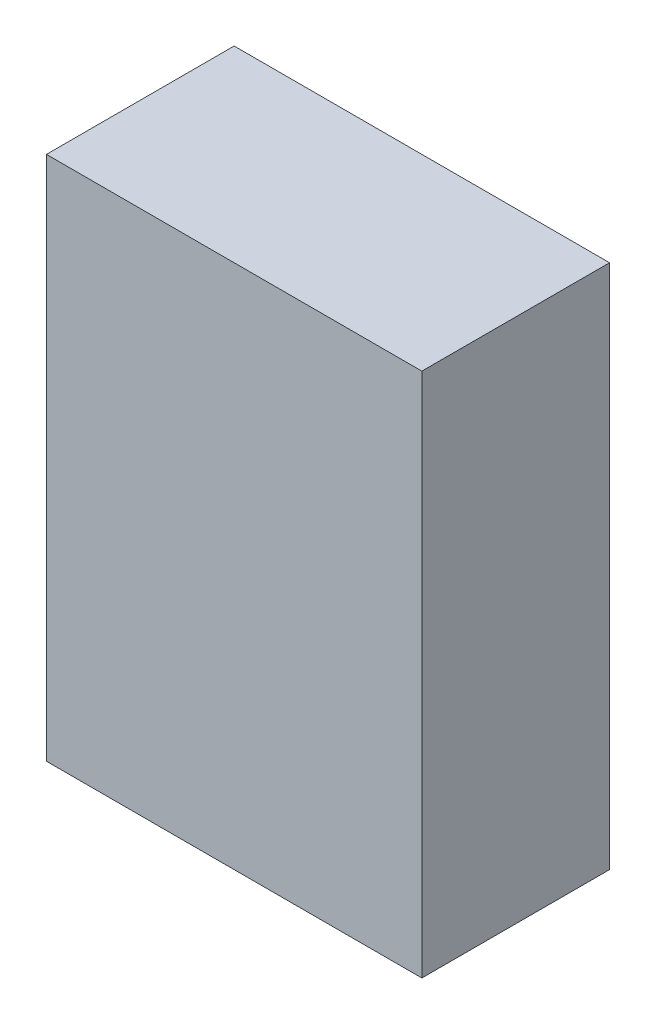
ISO-10303-21;
HEADER;
FILE_DESCRIPTION(('STEP AP214'),'2;1');
FILE_NAME('part.step','',(''),(''),'','','');
FILE_SCHEMA(('AUTOMOTIVE_DESIGN { 1 0 10303 214 1 1 1 1 }'));
ENDSEC;
DATA;
#1=APPLICATION_CONTEXT('core data for automotive mechanical design processes');
#2=APPLICATION_PROTOCOL_DEFINITION('international standard','automotive_design',2000,#1);
#3=PRODUCT_CONTEXT('',#1,'mechanical');
#4=PRODUCT('Part','Part','',(#3));
#5=PRODUCT_RELATED_PRODUCT_CATEGORY('part','',(#4));
#6=PRODUCT_DEFINITION_FORMATION('','',#4);
#7=PRODUCT_DEFINITION_CONTEXT('part definition',#1,'design');
#8=PRODUCT_DEFINITION('design','',#6,#7);
#9=PRODUCT_DEFINITION_SHAPE('','',#8);
#10=(LENGTH_UNIT() NAMED_UNIT(*) SI_UNIT(.MILLI.,.METRE.));
#11=(NAMED_UNIT(*) PLANE_ANGLE_UNIT() SI_UNIT($,.RADIAN.));
#12=(NAMED_UNIT(*) SI_UNIT($,.STERADIAN.) SOLID_ANGLE_UNIT());
#13=UNCERTAINTY_MEASURE_WITH_UNIT(LENGTH_MEASURE(1.E-05),#10,'distance_accuracy_value','');
#14=(GEOMETRIC_REPRESENTATION_CONTEXT(3) GLOBAL_UNCERTAINTY_ASSIGNED_CONTEXT((#13)) GLOBAL_UNIT_ASSIGNED_CONTEXT((#10,
#11,#12)) REPRESENTATION_CONTEXT('',''));
#15=CARTESIAN_POINT('',(0.,0.,0.));
#16=DIRECTION('',(0.,0.,1.));
#17=DIRECTION('',(1.,0.,0.));
#18=AXIS2_PLACEMENT_3D('',#15,#16,#17);
#19=CARTESIAN_POINT('',(0.,0.,250.));
#20=DIRECTION('',(1.,0.,0.));
#21=DIRECTION('',(0.,0.,-1.));
#22=AXIS2_PLACEMENT_3D('',#19,#20,#21);
#23=PLANE('',#22);
#24=DIRECTION('',(0.,-1.,0.));
#25=VECTOR('',#24,1.);
#26=CARTESIAN_POINT('',(0.,0.,0.));
#27=LINE('',#26,#25);
#28=CARTESIAN_POINT('',(0.,700.,0.));
#29=VERTEX_POINT('',#28);
#30=CARTESIAN_POINT('',(0.,0.,0.));
#31=VERTEX_POINT('',#30);
#32=EDGE_CURVE('E98',#29,#31,#27,.T.);
#33=ORIENTED_EDGE('',*,*,#32,.T.);
#34=DIRECTION('',(0.,0.,-1.));
#35=VECTOR('',#34,1.);
#36=CARTESIAN_POINT('',(0.,0.,250.));
#37=LINE('',#36,#35);
#38=CARTESIAN_POINT('',(0.,0.,250.));
#39=VERTEX_POINT('',#38);
#40=EDGE_CURVE('E11',#39,#31,#37,.T.);
#41=ORIENTED_EDGE('',*,*,#40,.F.);
#42=DIRECTION('',(0.,-1.,0.));
#43=VECTOR('',#42,1.);
#44=CARTESIAN_POINT('',(0.,0.,250.));
#45=LINE('',#44,#43);
#46=CARTESIAN_POINT('',(0.,700.,250.));
#47=VERTEX_POINT('',#46);
#48=EDGE_CURVE('E86',#47,#39,#45,.T.);
#49=ORIENTED_EDGE('',*,*,#48,.F.);
#50=DIRECTION('',(0.,0.,-1.));
#51=VECTOR('',#50,1.);
#52=CARTESIAN_POINT('',(0.,700.,250.));
#53=LINE('',#52,#51);
#54=EDGE_CURVE('E94',#47,#29,#53,.T.);
#55=ORIENTED_EDGE('',*,*,#54,.T.);
#56=EDGE_LOOP('',(#33,#41,#49,#55));
#57=FACE_BOUND('',#56,.T.);
#58=ADVANCED_FACE('F35',(#57),#23,.F.);
#59=CARTESIAN_POINT('',(0.,0.,250.));
#60=DIRECTION('',(0.,1.,0.));
#61=DIRECTION('',(0.,0.,1.));
#62=AXIS2_PLACEMENT_3D('',#59,#60,#61);
#63=PLANE('',#62);
#64=DIRECTION('',(1.,0.,0.));
#65=VECTOR('',#64,1.);
#66=CARTESIAN_POINT('',(0.,0.,0.));
#67=LINE('',#66,#65);
#68=CARTESIAN_POINT('',(500.,0.,0.));
#69=VERTEX_POINT('',#68);
#70=EDGE_CURVE('E90',#31,#69,#67,.T.);
#71=ORIENTED_EDGE('',*,*,#70,.T.);
#72=DIRECTION('',(0.,0.,-1.));
#73=VECTOR('',#72,1.);
#74=CARTESIAN_POINT('',(500.,0.,250.));
#75=LINE('',#74,#73);
#76=CARTESIAN_POINT('',(500.,0.,250.));
#77=VERTEX_POINT('',#76);
#78=EDGE_CURVE('E43',#77,#69,#75,.T.);
#79=ORIENTED_EDGE('',*,*,#78,.F.);
#80=DIRECTION('',(1.,0.,0.));
#81=VECTOR('',#80,1.);
#82=CARTESIAN_POINT('',(0.,0.,250.));
#83=LINE('',#82,#81);
#84=EDGE_CURVE('E81',#39,#77,#83,.T.);
#85=ORIENTED_EDGE('',*,*,#84,.F.);
#86=ORIENTED_EDGE('',*,*,#40,.T.);
#87=EDGE_LOOP('',(#71,#79,#85,#86));
#88=FACE_BOUND('',#87,.T.);
#89=ADVANCED_FACE('F89',(#88),#63,.F.);
#90=CARTESIAN_POINT('',(500.,0.,250.));
#91=DIRECTION('',(-1.,0.,0.));
#92=DIRECTION('',(0.,0.,1.));
#93=AXIS2_PLACEMENT_3D('',#90,#91,#92);
#94=PLANE('',#93);
#95=DIRECTION('',(0.,1.,0.));
#96=VECTOR('',#95,1.);
#97=CARTESIAN_POINT('',(500.,0.,0.));
#98=LINE('',#97,#96);
#99=CARTESIAN_POINT('',(500.,700.,0.));
#100=VERTEX_POINT('',#99);
#101=EDGE_CURVE('E68',#69,#100,#98,.T.);
#102=ORIENTED_EDGE('',*,*,#101,.T.);
#103=DIRECTION('',(0.,0.,-1.));
#104=VECTOR('',#103,1.);
#105=CARTESIAN_POINT('',(500.,700.,250.));
#106=LINE('',#105,#104);
#107=CARTESIAN_POINT('',(500.,700.,250.));
#108=VERTEX_POINT('',#107);
#109=EDGE_CURVE('E91',#108,#100,#106,.T.);
#110=ORIENTED_EDGE('',*,*,#109,.F.);
#111=DIRECTION('',(0.,1.,0.));
#112=VECTOR('',#111,1.);
#113=CARTESIAN_POINT('',(500.,0.,250.));
#114=LINE('',#113,#112);
#115=EDGE_CURVE('E84',#77,#108,#114,.T.);
#116=ORIENTED_EDGE('',*,*,#115,.F.);
#117=ORIENTED_EDGE('',*,*,#78,.T.);
#118=EDGE_LOOP('',(#102,#110,#116,#117));
#119=FACE_BOUND('',#118,.T.);
#120=ADVANCED_FACE('F92',(#119),#94,.F.);
#121=CARTESIAN_POINT('',(0.,700.,250.));
#122=DIRECTION('',(0.,-1.,0.));
#123=DIRECTION('',(0.,0.,-1.));
#124=AXIS2_PLACEMENT_3D('',#121,#122,#123);
#125=PLANE('',#124);
#126=DIRECTION('',(-1.,0.,0.));
#127=VECTOR('',#126,1.);
#128=CARTESIAN_POINT('',(0.,700.,0.));
#129=LINE('',#128,#127);
#130=EDGE_CURVE('E74',#100,#29,#129,.T.);
#131=ORIENTED_EDGE('',*,*,#130,.T.);
#132=ORIENTED_EDGE('',*,*,#54,.F.);
#133=DIRECTION('',(-1.,0.,0.));
#134=VECTOR('',#133,1.);
#135=CARTESIAN_POINT('',(0.,700.,250.));
#136=LINE('',#135,#134);
#137=EDGE_CURVE('E51',#108,#47,#136,.T.);
#138=ORIENTED_EDGE('',*,*,#137,.F.);
#139=ORIENTED_EDGE('',*,*,#109,.T.);
#140=EDGE_LOOP('',(#131,#132,#138,#139));
#141=FACE_BOUND('',#140,.T.);
#142=ADVANCED_FACE('F105',(#141),#125,.F.);
#143=CARTESIAN_POINT('',(0.,0.,250.));
#144=DIRECTION('',(0.,0.,-1.));
#145=DIRECTION('',(-1.,0.,0.));
#146=AXIS2_PLACEMENT_3D('',#143,#144,#145);
#147=PLANE('',#146);
#148=ORIENTED_EDGE('',*,*,#48,.T.);
#149=ORIENTED_EDGE('',*,*,#84,.T.);
#150=ORIENTED_EDGE('',*,*,#115,.T.);
#151=ORIENTED_EDGE('',*,*,#137,.T.);
#152=EDGE_LOOP('',(#148,#149,#150,#151));
#153=FACE_BOUND('',#152,.T.);
#154=ADVANCED_FACE('F82',(#153),#147,.F.);
#155=CARTESIAN_POINT('',(0.,0.,0.));
#156=DIRECTION('',(0.,0.,-1.));
#157=DIRECTION('',(-1.,0.,0.));
#158=AXIS2_PLACEMENT_3D('',#155,#156,#157);
#159=PLANE('',#158);
#160=ORIENTED_EDGE('',*,*,#32,.F.);
#161=ORIENTED_EDGE('',*,*,#130,.F.);
#162=ORIENTED_EDGE('',*,*,#101,.F.);
#163=ORIENTED_EDGE('',*,*,#70,.F.);
#164=EDGE_LOOP('',(#160,#161,#162,#163));
#165=FACE_BOUND('',#164,.T.);
#166=ADVANCED_FACE('F108',(#165),#159,.T.);
#167=CLOSED_SHELL('',(#58,#89,#120,#142,#154,#166));
#168=MANIFOLD_SOLID_BREP('B2',#167);
#169=ADVANCED_BREP_SHAPE_REPRESENTATION('',(#18,#168),#14);
#170=SHAPE_DEFINITION_REPRESENTATION(#9,#169);
ENDSEC;
END-ISO-10303-21;
